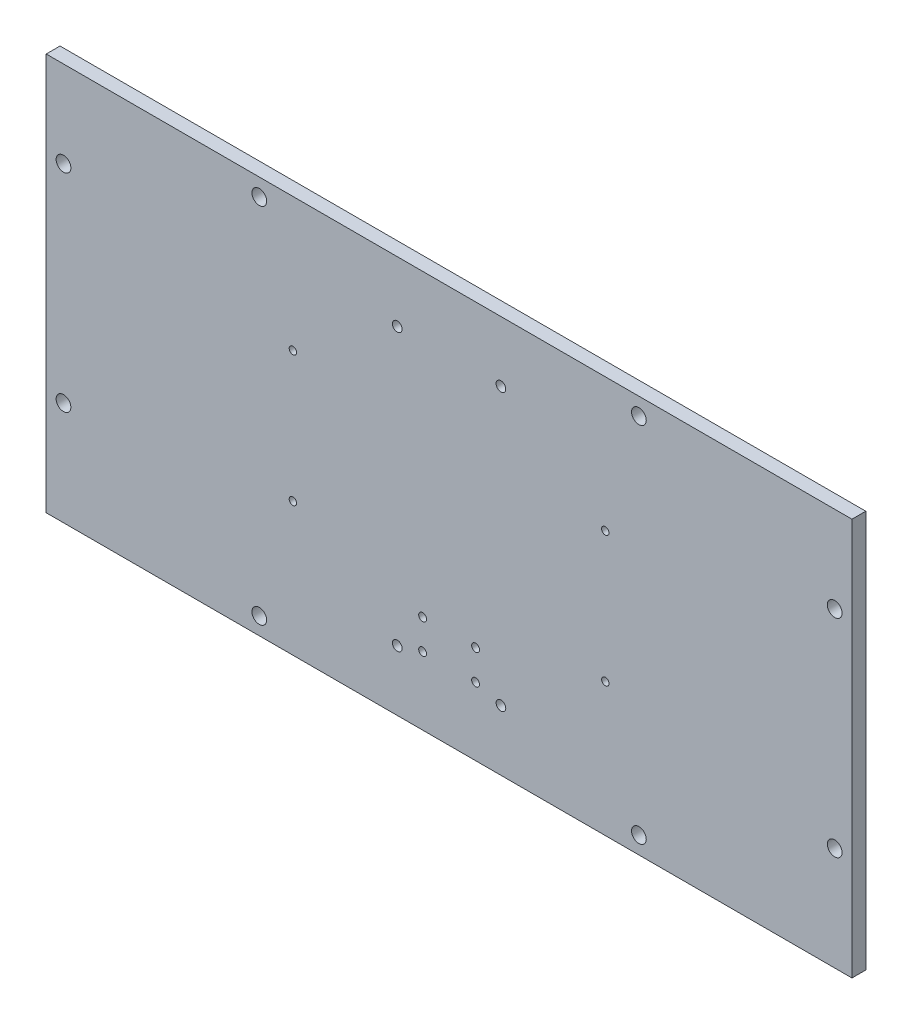
ISO-10303-21;
HEADER;
FILE_DESCRIPTION(('STEP AP214'),'2;1');
FILE_NAME('part.step','',(''),(''),'','','');
FILE_SCHEMA(('AUTOMOTIVE_DESIGN { 1 0 10303 214 1 1 1 1 }'));
ENDSEC;
DATA;
#1=APPLICATION_CONTEXT('core data for automotive mechanical design processes');
#2=APPLICATION_PROTOCOL_DEFINITION('international standard','automotive_design',2000,#1);
#3=PRODUCT_CONTEXT('',#1,'mechanical');
#4=PRODUCT('Part','Part','',(#3));
#5=PRODUCT_RELATED_PRODUCT_CATEGORY('part','',(#4));
#6=PRODUCT_DEFINITION_FORMATION('','',#4);
#7=PRODUCT_DEFINITION_CONTEXT('part definition',#1,'design');
#8=PRODUCT_DEFINITION('design','',#6,#7);
#9=PRODUCT_DEFINITION_SHAPE('','',#8);
#10=(LENGTH_UNIT() NAMED_UNIT(*) SI_UNIT(.MILLI.,.METRE.));
#11=(NAMED_UNIT(*) PLANE_ANGLE_UNIT() SI_UNIT($,.RADIAN.));
#12=(NAMED_UNIT(*) SI_UNIT($,.STERADIAN.) SOLID_ANGLE_UNIT());
#13=UNCERTAINTY_MEASURE_WITH_UNIT(LENGTH_MEASURE(1.E-05),#10,'distance_accuracy_value','');
#14=(GEOMETRIC_REPRESENTATION_CONTEXT(3) GLOBAL_UNCERTAINTY_ASSIGNED_CONTEXT((#13)) GLOBAL_UNIT_ASSIGNED_CONTEXT((#10,
#11,#12)) REPRESENTATION_CONTEXT('',''));
#15=CARTESIAN_POINT('',(0.,0.,0.));
#16=DIRECTION('',(0.,0.,1.));
#17=DIRECTION('',(1.,0.,0.));
#18=AXIS2_PLACEMENT_3D('',#15,#16,#17);
#19=CARTESIAN_POINT('',(0.,0.,6.));
#20=DIRECTION('',(0.,0.,1.));
#21=DIRECTION('',(1.,0.,0.));
#22=AXIS2_PLACEMENT_3D('',#19,#20,#21);
#23=PLANE('',#22);
#24=CARTESIAN_POINT('',(-82.4,-82.5,6.));
#25=DIRECTION('',(0.,0.,1.));
#26=DIRECTION('',(1.,0.,0.));
#27=AXIS2_PLACEMENT_3D('',#24,#25,#26);
#28=CIRCLE('',#27,3.19999999999999);
#29=CARTESIAN_POINT('',(-79.2,-82.5,6.));
#30=VERTEX_POINT('',#29);
#31=EDGE_CURVE('E216',#30,#30,#28,.T.);
#32=ORIENTED_EDGE('',*,*,#31,.F.);
#33=EDGE_LOOP('',(#32));
#34=FACE_BOUND('',#33,.T.);
#35=CARTESIAN_POINT('',(-11.5,-60.5,6.));
#36=DIRECTION('',(0.,0.,1.));
#37=DIRECTION('',(1.,0.,0.));
#38=AXIS2_PLACEMENT_3D('',#35,#36,#37);
#39=CIRCLE('',#38,1.7);
#40=CARTESIAN_POINT('',(-9.79999999999999,-60.5,6.));
#41=VERTEX_POINT('',#40);
#42=EDGE_CURVE('E204',#41,#41,#39,.T.);
#43=ORIENTED_EDGE('',*,*,#42,.F.);
#44=EDGE_LOOP('',(#43));
#45=FACE_BOUND('',#44,.T.);
#46=CARTESIAN_POINT('',(-11.5,-47.5,6.));
#47=DIRECTION('',(0.,0.,1.));
#48=DIRECTION('',(1.,0.,0.));
#49=AXIS2_PLACEMENT_3D('',#46,#47,#48);
#50=CIRCLE('',#49,1.7);
#51=CARTESIAN_POINT('',(-9.79999999999999,-47.5,6.));
#52=VERTEX_POINT('',#51);
#53=EDGE_CURVE('E192',#52,#52,#50,.T.);
#54=ORIENTED_EDGE('',*,*,#53,.F.);
#55=EDGE_LOOP('',(#54));
#56=FACE_BOUND('',#55,.T.);
#57=CARTESIAN_POINT('',(67.818,-32.0709999999999,6.));
#58=DIRECTION('',(0.,0.,1.));
#59=DIRECTION('',(1.,0.,0.));
#60=AXIS2_PLACEMENT_3D('',#57,#58,#59);
#61=CIRCLE('',#60,1.60000000000001);
#62=CARTESIAN_POINT('',(69.418,-32.0709999999999,6.));
#63=VERTEX_POINT('',#62);
#64=EDGE_CURVE('E180',#63,#63,#61,.T.);
#65=ORIENTED_EDGE('',*,*,#64,.F.);
#66=EDGE_LOOP('',(#65));
#67=FACE_BOUND('',#66,.T.);
#68=CARTESIAN_POINT('',(-67.818,24.5710000000001,6.));
#69=DIRECTION('',(0.,0.,1.));
#70=DIRECTION('',(1.,0.,0.));
#71=AXIS2_PLACEMENT_3D('',#68,#69,#70);
#72=CIRCLE('',#71,1.6);
#73=CARTESIAN_POINT('',(-66.218,24.5710000000001,6.));
#74=VERTEX_POINT('',#73);
#75=EDGE_CURVE('E168',#74,#74,#72,.T.);
#76=ORIENTED_EDGE('',*,*,#75,.F.);
#77=EDGE_LOOP('',(#76));
#78=FACE_BOUND('',#77,.T.);
#79=CARTESIAN_POINT('',(-167.4,45.,6.));
#80=DIRECTION('',(0.,0.,1.));
#81=DIRECTION('',(1.,0.,0.));
#82=AXIS2_PLACEMENT_3D('',#79,#80,#81);
#83=CIRCLE('',#82,3.19999999999998);
#84=CARTESIAN_POINT('',(-164.2,45.,6.));
#85=VERTEX_POINT('',#84);
#86=EDGE_CURVE('E156',#85,#85,#83,.T.);
#87=ORIENTED_EDGE('',*,*,#86,.F.);
#88=EDGE_LOOP('',(#87));
#89=FACE_BOUND('',#88,.T.);
#90=CARTESIAN_POINT('',(-22.5,56.25,6.));
#91=DIRECTION('',(0.,0.,1.));
#92=DIRECTION('',(1.,0.,0.));
#93=AXIS2_PLACEMENT_3D('',#90,#91,#92);
#94=CIRCLE('',#93,2.09999999999998);
#95=CARTESIAN_POINT('',(-20.4,56.25,6.));
#96=VERTEX_POINT('',#95);
#97=EDGE_CURVE('E144',#96,#96,#94,.T.);
#98=ORIENTED_EDGE('',*,*,#97,.F.);
#99=EDGE_LOOP('',(#98));
#100=FACE_BOUND('',#99,.T.);
#101=CARTESIAN_POINT('',(22.5,56.2500000000001,6.));
#102=DIRECTION('',(0.,0.,1.));
#103=DIRECTION('',(1.,0.,0.));
#104=AXIS2_PLACEMENT_3D('',#101,#102,#103);
#105=CIRCLE('',#104,2.09999999999998);
#106=CARTESIAN_POINT('',(24.6,56.2500000000001,6.));
#107=VERTEX_POINT('',#106);
#108=EDGE_CURVE('E132',#107,#107,#105,.T.);
#109=ORIENTED_EDGE('',*,*,#108,.F.);
#110=EDGE_LOOP('',(#109));
#111=FACE_BOUND('',#110,.T.);
#112=CARTESIAN_POINT('',(167.4,-45.,6.));
#113=DIRECTION('',(0.,0.,1.));
#114=DIRECTION('',(1.,0.,0.));
#115=AXIS2_PLACEMENT_3D('',#112,#113,#114);
#116=CIRCLE('',#115,3.19999999999998);
#117=CARTESIAN_POINT('',(170.6,-45.,6.));
#118=VERTEX_POINT('',#117);
#119=EDGE_CURVE('E120',#118,#118,#116,.T.);
#120=ORIENTED_EDGE('',*,*,#119,.F.);
#121=EDGE_LOOP('',(#120));
#122=FACE_BOUND('',#121,.T.);
#123=CARTESIAN_POINT('',(-82.4,75.,6.));
#124=DIRECTION('',(0.,0.,1.));
#125=DIRECTION('',(1.,0.,0.));
#126=AXIS2_PLACEMENT_3D('',#123,#124,#125);
#127=CIRCLE('',#126,3.19999999999998);
#128=CARTESIAN_POINT('',(-79.2,75.,6.));
#129=VERTEX_POINT('',#128);
#130=EDGE_CURVE('E99',#129,#129,#127,.T.);
#131=ORIENTED_EDGE('',*,*,#130,.F.);
#132=EDGE_LOOP('',(#131));
#133=FACE_BOUND('',#132,.T.);
#134=DIRECTION('',(0.,-1.,0.));
#135=VECTOR('',#134,1.);
#136=CARTESIAN_POINT('',(-174.9,82.5,6.));
#137=LINE('',#136,#135);
#138=CARTESIAN_POINT('',(-174.9,82.5,6.));
#139=VERTEX_POINT('',#138);
#140=CARTESIAN_POINT('',(-174.9,-90.,6.));
#141=VERTEX_POINT('',#140);
#142=EDGE_CURVE('E84',#139,#141,#137,.T.);
#143=ORIENTED_EDGE('',*,*,#142,.T.);
#144=DIRECTION('',(1.,0.,0.));
#145=VECTOR('',#144,1.);
#146=CARTESIAN_POINT('',(-174.9,-90.,6.));
#147=LINE('',#146,#145);
#148=CARTESIAN_POINT('',(174.9,-90.,6.));
#149=VERTEX_POINT('',#148);
#150=EDGE_CURVE('E79',#141,#149,#147,.T.);
#151=ORIENTED_EDGE('',*,*,#150,.T.);
#152=DIRECTION('',(0.,1.,0.));
#153=VECTOR('',#152,1.);
#154=CARTESIAN_POINT('',(174.9,82.5,6.));
#155=LINE('',#154,#153);
#156=CARTESIAN_POINT('',(174.9,82.5,6.));
#157=VERTEX_POINT('',#156);
#158=EDGE_CURVE('E82',#149,#157,#155,.T.);
#159=ORIENTED_EDGE('',*,*,#158,.T.);
#160=DIRECTION('',(-1.,0.,0.));
#161=VECTOR('',#160,1.);
#162=CARTESIAN_POINT('',(-174.9,82.5,6.));
#163=LINE('',#162,#161);
#164=EDGE_CURVE('E49',#157,#139,#163,.T.);
#165=ORIENTED_EDGE('',*,*,#164,.T.);
#166=EDGE_LOOP('',(#143,#151,#159,#165));
#167=FACE_BOUND('',#166,.T.);
#168=CARTESIAN_POINT('',(-167.4,-45.,6.));
#169=DIRECTION('',(0.,0.,1.));
#170=DIRECTION('',(1.,0.,0.));
#171=AXIS2_PLACEMENT_3D('',#168,#169,#170);
#172=CIRCLE('',#171,3.19999999999998);
#173=CARTESIAN_POINT('',(-164.2,-45.,6.));
#174=VERTEX_POINT('',#173);
#175=EDGE_CURVE('E114',#174,#174,#172,.T.);
#176=ORIENTED_EDGE('',*,*,#175,.F.);
#177=EDGE_LOOP('',(#176));
#178=FACE_BOUND('',#177,.T.);
#179=CARTESIAN_POINT('',(22.5,-63.7499999999999,6.));
#180=DIRECTION('',(0.,0.,1.));
#181=DIRECTION('',(1.,0.,0.));
#182=AXIS2_PLACEMENT_3D('',#179,#180,#181);
#183=CIRCLE('',#182,2.1);
#184=CARTESIAN_POINT('',(24.6,-63.7499999999999,6.));
#185=VERTEX_POINT('',#184);
#186=EDGE_CURVE('E126',#185,#185,#183,.T.);
#187=ORIENTED_EDGE('',*,*,#186,.F.);
#188=EDGE_LOOP('',(#187));
#189=FACE_BOUND('',#188,.T.);
#190=CARTESIAN_POINT('',(82.4,75.,6.));
#191=DIRECTION('',(0.,0.,1.));
#192=DIRECTION('',(1.,0.,0.));
#193=AXIS2_PLACEMENT_3D('',#190,#191,#192);
#194=CIRCLE('',#193,3.19999999999998);
#195=CARTESIAN_POINT('',(85.6,75.,6.));
#196=VERTEX_POINT('',#195);
#197=EDGE_CURVE('E138',#196,#196,#194,.T.);
#198=ORIENTED_EDGE('',*,*,#197,.F.);
#199=EDGE_LOOP('',(#198));
#200=FACE_BOUND('',#199,.T.);
#201=CARTESIAN_POINT('',(-22.5,-63.7499999999999,6.));
#202=DIRECTION('',(0.,0.,1.));
#203=DIRECTION('',(1.,0.,0.));
#204=AXIS2_PLACEMENT_3D('',#201,#202,#203);
#205=CIRCLE('',#204,2.1);
#206=CARTESIAN_POINT('',(-20.4,-63.7499999999999,6.));
#207=VERTEX_POINT('',#206);
#208=EDGE_CURVE('E150',#207,#207,#205,.T.);
#209=ORIENTED_EDGE('',*,*,#208,.F.);
#210=EDGE_LOOP('',(#209));
#211=FACE_BOUND('',#210,.T.);
#212=CARTESIAN_POINT('',(167.4,45.,6.));
#213=DIRECTION('',(0.,0.,1.));
#214=DIRECTION('',(1.,0.,0.));
#215=AXIS2_PLACEMENT_3D('',#212,#213,#214);
#216=CIRCLE('',#215,3.19999999999998);
#217=CARTESIAN_POINT('',(170.6,45.,6.));
#218=VERTEX_POINT('',#217);
#219=EDGE_CURVE('E162',#218,#218,#216,.T.);
#220=ORIENTED_EDGE('',*,*,#219,.F.);
#221=EDGE_LOOP('',(#220));
#222=FACE_BOUND('',#221,.T.);
#223=CARTESIAN_POINT('',(-67.818,-32.0709999999999,6.));
#224=DIRECTION('',(0.,0.,1.));
#225=DIRECTION('',(1.,0.,0.));
#226=AXIS2_PLACEMENT_3D('',#223,#224,#225);
#227=CIRCLE('',#226,1.60000000000001);
#228=CARTESIAN_POINT('',(-66.218,-32.0709999999999,6.));
#229=VERTEX_POINT('',#228);
#230=EDGE_CURVE('E174',#229,#229,#227,.T.);
#231=ORIENTED_EDGE('',*,*,#230,.F.);
#232=EDGE_LOOP('',(#231));
#233=FACE_BOUND('',#232,.T.);
#234=CARTESIAN_POINT('',(67.818,24.5710000000001,6.));
#235=DIRECTION('',(0.,0.,1.));
#236=DIRECTION('',(1.,0.,0.));
#237=AXIS2_PLACEMENT_3D('',#234,#235,#236);
#238=CIRCLE('',#237,1.6);
#239=CARTESIAN_POINT('',(69.418,24.5710000000001,6.));
#240=VERTEX_POINT('',#239);
#241=EDGE_CURVE('E186',#240,#240,#238,.T.);
#242=ORIENTED_EDGE('',*,*,#241,.F.);
#243=EDGE_LOOP('',(#242));
#244=FACE_BOUND('',#243,.T.);
#245=CARTESIAN_POINT('',(11.4999999999999,-47.5,6.));
#246=DIRECTION('',(0.,0.,1.));
#247=DIRECTION('',(1.,0.,0.));
#248=AXIS2_PLACEMENT_3D('',#245,#246,#247);
#249=CIRCLE('',#248,1.7);
#250=CARTESIAN_POINT('',(13.1999999999999,-47.5,6.));
#251=VERTEX_POINT('',#250);
#252=EDGE_CURVE('E198',#251,#251,#249,.T.);
#253=ORIENTED_EDGE('',*,*,#252,.F.);
#254=EDGE_LOOP('',(#253));
#255=FACE_BOUND('',#254,.T.);
#256=CARTESIAN_POINT('',(11.4999999999999,-60.5,6.));
#257=DIRECTION('',(0.,0.,1.));
#258=DIRECTION('',(1.,0.,0.));
#259=AXIS2_PLACEMENT_3D('',#256,#257,#258);
#260=CIRCLE('',#259,1.7);
#261=CARTESIAN_POINT('',(13.1999999999999,-60.5,6.));
#262=VERTEX_POINT('',#261);
#263=EDGE_CURVE('E210',#262,#262,#260,.T.);
#264=ORIENTED_EDGE('',*,*,#263,.F.);
#265=EDGE_LOOP('',(#264));
#266=FACE_BOUND('',#265,.T.);
#267=CARTESIAN_POINT('',(82.4,-82.5,6.));
#268=DIRECTION('',(0.,0.,1.));
#269=DIRECTION('',(1.,0.,0.));
#270=AXIS2_PLACEMENT_3D('',#267,#268,#269);
#271=CIRCLE('',#270,3.19999999999999);
#272=CARTESIAN_POINT('',(85.6,-82.5,6.));
#273=VERTEX_POINT('',#272);
#274=EDGE_CURVE('E222',#273,#273,#271,.T.);
#275=ORIENTED_EDGE('',*,*,#274,.F.);
#276=EDGE_LOOP('',(#275));
#277=FACE_BOUND('',#276,.T.);
#278=ADVANCED_FACE('F32',(#34,#45,#56,#67,#78,#89,#100,#111,#122,#133,#167,#178,#189,#200,#211,
#222,#233,#244,#255,#266,#277),#23,.T.);
#279=CARTESIAN_POINT('',(0.,0.,0.));
#280=DIRECTION('',(0.,0.,1.));
#281=DIRECTION('',(1.,0.,0.));
#282=AXIS2_PLACEMENT_3D('',#279,#280,#281);
#283=PLANE('',#282);
#284=CARTESIAN_POINT('',(-82.4,-82.5,0.));
#285=DIRECTION('',(0.,0.,1.));
#286=DIRECTION('',(1.,0.,0.));
#287=AXIS2_PLACEMENT_3D('',#284,#285,#286);
#288=CIRCLE('',#287,3.19999999999999);
#289=CARTESIAN_POINT('',(-79.2,-82.5,0.));
#290=VERTEX_POINT('',#289);
#291=EDGE_CURVE('E219',#290,#290,#288,.T.);
#292=ORIENTED_EDGE('',*,*,#291,.T.);
#293=EDGE_LOOP('',(#292));
#294=FACE_BOUND('',#293,.T.);
#295=CARTESIAN_POINT('',(-11.5,-60.5,0.));
#296=DIRECTION('',(0.,0.,1.));
#297=DIRECTION('',(1.,0.,0.));
#298=AXIS2_PLACEMENT_3D('',#295,#296,#297);
#299=CIRCLE('',#298,1.7);
#300=CARTESIAN_POINT('',(-9.79999999999999,-60.5,0.));
#301=VERTEX_POINT('',#300);
#302=EDGE_CURVE('E207',#301,#301,#299,.T.);
#303=ORIENTED_EDGE('',*,*,#302,.T.);
#304=EDGE_LOOP('',(#303));
#305=FACE_BOUND('',#304,.T.);
#306=CARTESIAN_POINT('',(-11.5,-47.5,0.));
#307=DIRECTION('',(0.,0.,1.));
#308=DIRECTION('',(1.,0.,0.));
#309=AXIS2_PLACEMENT_3D('',#306,#307,#308);
#310=CIRCLE('',#309,1.7);
#311=CARTESIAN_POINT('',(-9.79999999999999,-47.5,0.));
#312=VERTEX_POINT('',#311);
#313=EDGE_CURVE('E195',#312,#312,#310,.T.);
#314=ORIENTED_EDGE('',*,*,#313,.T.);
#315=EDGE_LOOP('',(#314));
#316=FACE_BOUND('',#315,.T.);
#317=CARTESIAN_POINT('',(67.818,-32.0709999999999,0.));
#318=DIRECTION('',(0.,0.,1.));
#319=DIRECTION('',(1.,0.,0.));
#320=AXIS2_PLACEMENT_3D('',#317,#318,#319);
#321=CIRCLE('',#320,1.60000000000001);
#322=CARTESIAN_POINT('',(69.418,-32.0709999999999,0.));
#323=VERTEX_POINT('',#322);
#324=EDGE_CURVE('E183',#323,#323,#321,.T.);
#325=ORIENTED_EDGE('',*,*,#324,.T.);
#326=EDGE_LOOP('',(#325));
#327=FACE_BOUND('',#326,.T.);
#328=CARTESIAN_POINT('',(-67.818,24.5710000000001,0.));
#329=DIRECTION('',(0.,0.,1.));
#330=DIRECTION('',(1.,0.,0.));
#331=AXIS2_PLACEMENT_3D('',#328,#329,#330);
#332=CIRCLE('',#331,1.6);
#333=CARTESIAN_POINT('',(-66.218,24.5710000000001,0.));
#334=VERTEX_POINT('',#333);
#335=EDGE_CURVE('E171',#334,#334,#332,.T.);
#336=ORIENTED_EDGE('',*,*,#335,.T.);
#337=EDGE_LOOP('',(#336));
#338=FACE_BOUND('',#337,.T.);
#339=CARTESIAN_POINT('',(-167.4,45.,0.));
#340=DIRECTION('',(0.,0.,1.));
#341=DIRECTION('',(1.,0.,0.));
#342=AXIS2_PLACEMENT_3D('',#339,#340,#341);
#343=CIRCLE('',#342,3.19999999999998);
#344=CARTESIAN_POINT('',(-164.2,45.,0.));
#345=VERTEX_POINT('',#344);
#346=EDGE_CURVE('E159',#345,#345,#343,.T.);
#347=ORIENTED_EDGE('',*,*,#346,.T.);
#348=EDGE_LOOP('',(#347));
#349=FACE_BOUND('',#348,.T.);
#350=CARTESIAN_POINT('',(-22.5,56.25,0.));
#351=DIRECTION('',(0.,0.,1.));
#352=DIRECTION('',(1.,0.,0.));
#353=AXIS2_PLACEMENT_3D('',#350,#351,#352);
#354=CIRCLE('',#353,2.09999999999998);
#355=CARTESIAN_POINT('',(-20.4,56.25,0.));
#356=VERTEX_POINT('',#355);
#357=EDGE_CURVE('E147',#356,#356,#354,.T.);
#358=ORIENTED_EDGE('',*,*,#357,.T.);
#359=EDGE_LOOP('',(#358));
#360=FACE_BOUND('',#359,.T.);
#361=CARTESIAN_POINT('',(22.5,56.2500000000001,0.));
#362=DIRECTION('',(0.,0.,1.));
#363=DIRECTION('',(1.,0.,0.));
#364=AXIS2_PLACEMENT_3D('',#361,#362,#363);
#365=CIRCLE('',#364,2.09999999999998);
#366=CARTESIAN_POINT('',(24.6,56.2500000000001,0.));
#367=VERTEX_POINT('',#366);
#368=EDGE_CURVE('E135',#367,#367,#365,.T.);
#369=ORIENTED_EDGE('',*,*,#368,.T.);
#370=EDGE_LOOP('',(#369));
#371=FACE_BOUND('',#370,.T.);
#372=CARTESIAN_POINT('',(167.4,-45.,0.));
#373=DIRECTION('',(0.,0.,1.));
#374=DIRECTION('',(1.,0.,0.));
#375=AXIS2_PLACEMENT_3D('',#372,#373,#374);
#376=CIRCLE('',#375,3.19999999999998);
#377=CARTESIAN_POINT('',(170.6,-45.,0.));
#378=VERTEX_POINT('',#377);
#379=EDGE_CURVE('E123',#378,#378,#376,.T.);
#380=ORIENTED_EDGE('',*,*,#379,.T.);
#381=EDGE_LOOP('',(#380));
#382=FACE_BOUND('',#381,.T.);
#383=CARTESIAN_POINT('',(-82.4,75.,0.));
#384=DIRECTION('',(0.,0.,1.));
#385=DIRECTION('',(1.,0.,0.));
#386=AXIS2_PLACEMENT_3D('',#383,#384,#385);
#387=CIRCLE('',#386,3.19999999999998);
#388=CARTESIAN_POINT('',(-79.2,75.,0.));
#389=VERTEX_POINT('',#388);
#390=EDGE_CURVE('E111',#389,#389,#387,.T.);
#391=ORIENTED_EDGE('',*,*,#390,.T.);
#392=EDGE_LOOP('',(#391));
#393=FACE_BOUND('',#392,.T.);
#394=DIRECTION('',(0.,-1.,0.));
#395=VECTOR('',#394,1.);
#396=CARTESIAN_POINT('',(-174.9,82.5,0.));
#397=LINE('',#396,#395);
#398=CARTESIAN_POINT('',(-174.9,82.5,0.));
#399=VERTEX_POINT('',#398);
#400=CARTESIAN_POINT('',(-174.9,-90.,0.));
#401=VERTEX_POINT('',#400);
#402=EDGE_CURVE('E96',#399,#401,#397,.T.);
#403=ORIENTED_EDGE('',*,*,#402,.F.);
#404=DIRECTION('',(-1.,0.,0.));
#405=VECTOR('',#404,1.);
#406=CARTESIAN_POINT('',(-174.9,82.5,0.));
#407=LINE('',#406,#405);
#408=CARTESIAN_POINT('',(174.9,82.5,0.));
#409=VERTEX_POINT('',#408);
#410=EDGE_CURVE('E72',#409,#399,#407,.T.);
#411=ORIENTED_EDGE('',*,*,#410,.F.);
#412=DIRECTION('',(0.,1.,0.));
#413=VECTOR('',#412,1.);
#414=CARTESIAN_POINT('',(174.9,82.5,0.));
#415=LINE('',#414,#413);
#416=CARTESIAN_POINT('',(174.9,-90.,0.));
#417=VERTEX_POINT('',#416);
#418=EDGE_CURVE('E66',#417,#409,#415,.T.);
#419=ORIENTED_EDGE('',*,*,#418,.F.);
#420=DIRECTION('',(1.,0.,0.));
#421=VECTOR('',#420,1.);
#422=CARTESIAN_POINT('',(-174.9,-90.,0.));
#423=LINE('',#422,#421);
#424=EDGE_CURVE('E88',#401,#417,#423,.T.);
#425=ORIENTED_EDGE('',*,*,#424,.F.);
#426=EDGE_LOOP('',(#403,#411,#419,#425));
#427=FACE_BOUND('',#426,.T.);
#428=CARTESIAN_POINT('',(-167.4,-45.,0.));
#429=DIRECTION('',(0.,0.,1.));
#430=DIRECTION('',(1.,0.,0.));
#431=AXIS2_PLACEMENT_3D('',#428,#429,#430);
#432=CIRCLE('',#431,3.19999999999998);
#433=CARTESIAN_POINT('',(-164.2,-45.,0.));
#434=VERTEX_POINT('',#433);
#435=EDGE_CURVE('E117',#434,#434,#432,.T.);
#436=ORIENTED_EDGE('',*,*,#435,.T.);
#437=EDGE_LOOP('',(#436));
#438=FACE_BOUND('',#437,.T.);
#439=CARTESIAN_POINT('',(22.5,-63.7499999999999,0.));
#440=DIRECTION('',(0.,0.,1.));
#441=DIRECTION('',(1.,0.,0.));
#442=AXIS2_PLACEMENT_3D('',#439,#440,#441);
#443=CIRCLE('',#442,2.1);
#444=CARTESIAN_POINT('',(24.6,-63.7499999999999,0.));
#445=VERTEX_POINT('',#444);
#446=EDGE_CURVE('E129',#445,#445,#443,.T.);
#447=ORIENTED_EDGE('',*,*,#446,.T.);
#448=EDGE_LOOP('',(#447));
#449=FACE_BOUND('',#448,.T.);
#450=CARTESIAN_POINT('',(82.4,75.,0.));
#451=DIRECTION('',(0.,0.,1.));
#452=DIRECTION('',(1.,0.,0.));
#453=AXIS2_PLACEMENT_3D('',#450,#451,#452);
#454=CIRCLE('',#453,3.19999999999998);
#455=CARTESIAN_POINT('',(85.6,75.,0.));
#456=VERTEX_POINT('',#455);
#457=EDGE_CURVE('E141',#456,#456,#454,.T.);
#458=ORIENTED_EDGE('',*,*,#457,.T.);
#459=EDGE_LOOP('',(#458));
#460=FACE_BOUND('',#459,.T.);
#461=CARTESIAN_POINT('',(-22.5,-63.7499999999999,0.));
#462=DIRECTION('',(0.,0.,1.));
#463=DIRECTION('',(1.,0.,0.));
#464=AXIS2_PLACEMENT_3D('',#461,#462,#463);
#465=CIRCLE('',#464,2.1);
#466=CARTESIAN_POINT('',(-20.4,-63.7499999999999,0.));
#467=VERTEX_POINT('',#466);
#468=EDGE_CURVE('E153',#467,#467,#465,.T.);
#469=ORIENTED_EDGE('',*,*,#468,.T.);
#470=EDGE_LOOP('',(#469));
#471=FACE_BOUND('',#470,.T.);
#472=CARTESIAN_POINT('',(167.4,45.,0.));
#473=DIRECTION('',(0.,0.,1.));
#474=DIRECTION('',(1.,0.,0.));
#475=AXIS2_PLACEMENT_3D('',#472,#473,#474);
#476=CIRCLE('',#475,3.19999999999998);
#477=CARTESIAN_POINT('',(170.6,45.,0.));
#478=VERTEX_POINT('',#477);
#479=EDGE_CURVE('E165',#478,#478,#476,.T.);
#480=ORIENTED_EDGE('',*,*,#479,.T.);
#481=EDGE_LOOP('',(#480));
#482=FACE_BOUND('',#481,.T.);
#483=CARTESIAN_POINT('',(-67.818,-32.0709999999999,0.));
#484=DIRECTION('',(0.,0.,1.));
#485=DIRECTION('',(1.,0.,0.));
#486=AXIS2_PLACEMENT_3D('',#483,#484,#485);
#487=CIRCLE('',#486,1.60000000000001);
#488=CARTESIAN_POINT('',(-66.218,-32.0709999999999,0.));
#489=VERTEX_POINT('',#488);
#490=EDGE_CURVE('E177',#489,#489,#487,.T.);
#491=ORIENTED_EDGE('',*,*,#490,.T.);
#492=EDGE_LOOP('',(#491));
#493=FACE_BOUND('',#492,.T.);
#494=CARTESIAN_POINT('',(67.818,24.5710000000001,0.));
#495=DIRECTION('',(0.,0.,1.));
#496=DIRECTION('',(1.,0.,0.));
#497=AXIS2_PLACEMENT_3D('',#494,#495,#496);
#498=CIRCLE('',#497,1.6);
#499=CARTESIAN_POINT('',(69.418,24.5710000000001,0.));
#500=VERTEX_POINT('',#499);
#501=EDGE_CURVE('E189',#500,#500,#498,.T.);
#502=ORIENTED_EDGE('',*,*,#501,.T.);
#503=EDGE_LOOP('',(#502));
#504=FACE_BOUND('',#503,.T.);
#505=CARTESIAN_POINT('',(11.4999999999999,-47.5,0.));
#506=DIRECTION('',(0.,0.,1.));
#507=DIRECTION('',(1.,0.,0.));
#508=AXIS2_PLACEMENT_3D('',#505,#506,#507);
#509=CIRCLE('',#508,1.7);
#510=CARTESIAN_POINT('',(13.1999999999999,-47.5,0.));
#511=VERTEX_POINT('',#510);
#512=EDGE_CURVE('E201',#511,#511,#509,.T.);
#513=ORIENTED_EDGE('',*,*,#512,.T.);
#514=EDGE_LOOP('',(#513));
#515=FACE_BOUND('',#514,.T.);
#516=CARTESIAN_POINT('',(11.4999999999999,-60.5,0.));
#517=DIRECTION('',(0.,0.,1.));
#518=DIRECTION('',(1.,0.,0.));
#519=AXIS2_PLACEMENT_3D('',#516,#517,#518);
#520=CIRCLE('',#519,1.7);
#521=CARTESIAN_POINT('',(13.1999999999999,-60.5,0.));
#522=VERTEX_POINT('',#521);
#523=EDGE_CURVE('E213',#522,#522,#520,.T.);
#524=ORIENTED_EDGE('',*,*,#523,.T.);
#525=EDGE_LOOP('',(#524));
#526=FACE_BOUND('',#525,.T.);
#527=CARTESIAN_POINT('',(82.4,-82.5,0.));
#528=DIRECTION('',(0.,0.,1.));
#529=DIRECTION('',(1.,0.,0.));
#530=AXIS2_PLACEMENT_3D('',#527,#528,#529);
#531=CIRCLE('',#530,3.19999999999999);
#532=CARTESIAN_POINT('',(85.6,-82.5,0.));
#533=VERTEX_POINT('',#532);
#534=EDGE_CURVE('E225',#533,#533,#531,.T.);
#535=ORIENTED_EDGE('',*,*,#534,.T.);
#536=EDGE_LOOP('',(#535));
#537=FACE_BOUND('',#536,.T.);
#538=ADVANCED_FACE('F107',(#294,#305,#316,#327,#338,#349,#360,#371,#382,#393,#427,#438,#449,
#460,#471,#482,#493,#504,#515,#526,#537),#283,.F.);
#539=CARTESIAN_POINT('',(-174.9,82.5,6.));
#540=DIRECTION('',(1.,0.,0.));
#541=DIRECTION('',(0.,1.,0.));
#542=AXIS2_PLACEMENT_3D('',#539,#540,#541);
#543=PLANE('',#542);
#544=ORIENTED_EDGE('',*,*,#402,.T.);
#545=DIRECTION('',(0.,0.,-1.));
#546=VECTOR('',#545,1.);
#547=CARTESIAN_POINT('',(-174.9,-90.,6.));
#548=LINE('',#547,#546);
#549=EDGE_CURVE('E11',#141,#401,#548,.T.);
#550=ORIENTED_EDGE('',*,*,#549,.F.);
#551=ORIENTED_EDGE('',*,*,#142,.F.);
#552=DIRECTION('',(0.,0.,-1.));
#553=VECTOR('',#552,1.);
#554=CARTESIAN_POINT('',(-174.9,82.5,6.));
#555=LINE('',#554,#553);
#556=EDGE_CURVE('E92',#139,#399,#555,.T.);
#557=ORIENTED_EDGE('',*,*,#556,.T.);
#558=EDGE_LOOP('',(#544,#550,#551,#557));
#559=FACE_BOUND('',#558,.T.);
#560=ADVANCED_FACE('F34',(#559),#543,.F.);
#561=CARTESIAN_POINT('',(-174.9,-90.,6.));
#562=DIRECTION('',(0.,1.,0.));
#563=DIRECTION('',(-1.,0.,0.));
#564=AXIS2_PLACEMENT_3D('',#561,#562,#563);
#565=PLANE('',#564);
#566=ORIENTED_EDGE('',*,*,#424,.T.);
#567=DIRECTION('',(0.,0.,-1.));
#568=VECTOR('',#567,1.);
#569=CARTESIAN_POINT('',(174.9,-90.,6.));
#570=LINE('',#569,#568);
#571=EDGE_CURVE('E41',#149,#417,#570,.T.);
#572=ORIENTED_EDGE('',*,*,#571,.F.);
#573=ORIENTED_EDGE('',*,*,#150,.F.);
#574=ORIENTED_EDGE('',*,*,#549,.T.);
#575=EDGE_LOOP('',(#566,#572,#573,#574));
#576=FACE_BOUND('',#575,.T.);
#577=ADVANCED_FACE('F87',(#576),#565,.F.);
#578=CARTESIAN_POINT('',(174.9,82.5,6.));
#579=DIRECTION('',(-1.,0.,0.));
#580=DIRECTION('',(0.,-1.,0.));
#581=AXIS2_PLACEMENT_3D('',#578,#579,#580);
#582=PLANE('',#581);
#583=ORIENTED_EDGE('',*,*,#418,.T.);
#584=DIRECTION('',(0.,0.,-1.));
#585=VECTOR('',#584,1.);
#586=CARTESIAN_POINT('',(174.9,82.5,6.));
#587=LINE('',#586,#585);
#588=EDGE_CURVE('E89',#157,#409,#587,.T.);
#589=ORIENTED_EDGE('',*,*,#588,.F.);
#590=ORIENTED_EDGE('',*,*,#158,.F.);
#591=ORIENTED_EDGE('',*,*,#571,.T.);
#592=EDGE_LOOP('',(#583,#589,#590,#591));
#593=FACE_BOUND('',#592,.T.);
#594=ADVANCED_FACE('F90',(#593),#582,.F.);
#595=CARTESIAN_POINT('',(-174.9,82.5,6.));
#596=DIRECTION('',(0.,-1.,0.));
#597=DIRECTION('',(0.,0.,-1.));
#598=AXIS2_PLACEMENT_3D('',#595,#596,#597);
#599=PLANE('',#598);
#600=ORIENTED_EDGE('',*,*,#410,.T.);
#601=ORIENTED_EDGE('',*,*,#556,.F.);
#602=ORIENTED_EDGE('',*,*,#164,.F.);
#603=ORIENTED_EDGE('',*,*,#588,.T.);
#604=EDGE_LOOP('',(#600,#601,#602,#603));
#605=FACE_BOUND('',#604,.T.);
#606=ADVANCED_FACE('F104',(#605),#599,.F.);
#607=CARTESIAN_POINT('',(-82.4,75.,6.));
#608=DIRECTION('',(0.,0.,-1.));
#609=DIRECTION('',(-1.,0.,0.));
#610=AXIS2_PLACEMENT_3D('',#607,#608,#609);
#611=CYLINDRICAL_SURFACE('',#610,3.19999999999998);
#612=ORIENTED_EDGE('',*,*,#130,.T.);
#613=EDGE_LOOP('',(#612));
#614=FACE_BOUND('',#613,.T.);
#615=ORIENTED_EDGE('',*,*,#390,.F.);
#616=EDGE_LOOP('',(#615));
#617=FACE_BOUND('',#616,.T.);
#618=ADVANCED_FACE('F245',(#614,#617),#611,.F.);
#619=CARTESIAN_POINT('',(-167.4,-45.,6.));
#620=DIRECTION('',(0.,0.,-1.));
#621=DIRECTION('',(-1.,0.,0.));
#622=AXIS2_PLACEMENT_3D('',#619,#620,#621);
#623=CYLINDRICAL_SURFACE('',#622,3.19999999999998);
#624=ORIENTED_EDGE('',*,*,#175,.T.);
#625=EDGE_LOOP('',(#624));
#626=FACE_BOUND('',#625,.T.);
#627=ORIENTED_EDGE('',*,*,#435,.F.);
#628=EDGE_LOOP('',(#627));
#629=FACE_BOUND('',#628,.T.);
#630=ADVANCED_FACE('F291',(#626,#629),#623,.F.);
#631=CARTESIAN_POINT('',(167.4,-45.,6.));
#632=DIRECTION('',(0.,0.,-1.));
#633=DIRECTION('',(-1.,0.,0.));
#634=AXIS2_PLACEMENT_3D('',#631,#632,#633);
#635=CYLINDRICAL_SURFACE('',#634,3.19999999999998);
#636=ORIENTED_EDGE('',*,*,#119,.T.);
#637=EDGE_LOOP('',(#636));
#638=FACE_BOUND('',#637,.T.);
#639=ORIENTED_EDGE('',*,*,#379,.F.);
#640=EDGE_LOOP('',(#639));
#641=FACE_BOUND('',#640,.T.);
#642=ADVANCED_FACE('F299',(#638,#641),#635,.F.);
#643=CARTESIAN_POINT('',(22.5,-63.7499999999999,6.));
#644=DIRECTION('',(0.,0.,-1.));
#645=DIRECTION('',(-1.,0.,0.));
#646=AXIS2_PLACEMENT_3D('',#643,#644,#645);
#647=CYLINDRICAL_SURFACE('',#646,2.1);
#648=ORIENTED_EDGE('',*,*,#186,.T.);
#649=EDGE_LOOP('',(#648));
#650=FACE_BOUND('',#649,.T.);
#651=ORIENTED_EDGE('',*,*,#446,.F.);
#652=EDGE_LOOP('',(#651));
#653=FACE_BOUND('',#652,.T.);
#654=ADVANCED_FACE('F307',(#650,#653),#647,.F.);
#655=CARTESIAN_POINT('',(22.5,56.2500000000001,6.));
#656=DIRECTION('',(0.,0.,-1.));
#657=DIRECTION('',(-1.,0.,0.));
#658=AXIS2_PLACEMENT_3D('',#655,#656,#657);
#659=CYLINDRICAL_SURFACE('',#658,2.09999999999998);
#660=ORIENTED_EDGE('',*,*,#108,.T.);
#661=EDGE_LOOP('',(#660));
#662=FACE_BOUND('',#661,.T.);
#663=ORIENTED_EDGE('',*,*,#368,.F.);
#664=EDGE_LOOP('',(#663));
#665=FACE_BOUND('',#664,.T.);
#666=ADVANCED_FACE('F316',(#662,#665),#659,.F.);
#667=CARTESIAN_POINT('',(82.4,75.,6.));
#668=DIRECTION('',(0.,0.,-1.));
#669=DIRECTION('',(-1.,0.,0.));
#670=AXIS2_PLACEMENT_3D('',#667,#668,#669);
#671=CYLINDRICAL_SURFACE('',#670,3.19999999999998);
#672=ORIENTED_EDGE('',*,*,#197,.T.);
#673=EDGE_LOOP('',(#672));
#674=FACE_BOUND('',#673,.T.);
#675=ORIENTED_EDGE('',*,*,#457,.F.);
#676=EDGE_LOOP('',(#675));
#677=FACE_BOUND('',#676,.T.);
#678=ADVANCED_FACE('F325',(#674,#677),#671,.F.);
#679=CARTESIAN_POINT('',(-22.5,56.25,6.));
#680=DIRECTION('',(0.,0.,-1.));
#681=DIRECTION('',(-1.,0.,0.));
#682=AXIS2_PLACEMENT_3D('',#679,#680,#681);
#683=CYLINDRICAL_SURFACE('',#682,2.09999999999998);
#684=ORIENTED_EDGE('',*,*,#97,.T.);
#685=EDGE_LOOP('',(#684));
#686=FACE_BOUND('',#685,.T.);
#687=ORIENTED_EDGE('',*,*,#357,.F.);
#688=EDGE_LOOP('',(#687));
#689=FACE_BOUND('',#688,.T.);
#690=ADVANCED_FACE('F334',(#686,#689),#683,.F.);
#691=CARTESIAN_POINT('',(-22.5,-63.7499999999999,6.));
#692=DIRECTION('',(0.,0.,-1.));
#693=DIRECTION('',(-1.,0.,0.));
#694=AXIS2_PLACEMENT_3D('',#691,#692,#693);
#695=CYLINDRICAL_SURFACE('',#694,2.1);
#696=ORIENTED_EDGE('',*,*,#208,.T.);
#697=EDGE_LOOP('',(#696));
#698=FACE_BOUND('',#697,.T.);
#699=ORIENTED_EDGE('',*,*,#468,.F.);
#700=EDGE_LOOP('',(#699));
#701=FACE_BOUND('',#700,.T.);
#702=ADVANCED_FACE('F343',(#698,#701),#695,.F.);
#703=CARTESIAN_POINT('',(-167.4,45.,6.));
#704=DIRECTION('',(0.,0.,-1.));
#705=DIRECTION('',(-1.,0.,0.));
#706=AXIS2_PLACEMENT_3D('',#703,#704,#705);
#707=CYLINDRICAL_SURFACE('',#706,3.19999999999998);
#708=ORIENTED_EDGE('',*,*,#86,.T.);
#709=EDGE_LOOP('',(#708));
#710=FACE_BOUND('',#709,.T.);
#711=ORIENTED_EDGE('',*,*,#346,.F.);
#712=EDGE_LOOP('',(#711));
#713=FACE_BOUND('',#712,.T.);
#714=ADVANCED_FACE('F352',(#710,#713),#707,.F.);
#715=CARTESIAN_POINT('',(167.4,45.,6.));
#716=DIRECTION('',(0.,0.,-1.));
#717=DIRECTION('',(-1.,0.,0.));
#718=AXIS2_PLACEMENT_3D('',#715,#716,#717);
#719=CYLINDRICAL_SURFACE('',#718,3.19999999999998);
#720=ORIENTED_EDGE('',*,*,#219,.T.);
#721=EDGE_LOOP('',(#720));
#722=FACE_BOUND('',#721,.T.);
#723=ORIENTED_EDGE('',*,*,#479,.F.);
#724=EDGE_LOOP('',(#723));
#725=FACE_BOUND('',#724,.T.);
#726=ADVANCED_FACE('F361',(#722,#725),#719,.F.);
#727=CARTESIAN_POINT('',(-67.818,24.5710000000001,6.));
#728=DIRECTION('',(0.,0.,-1.));
#729=DIRECTION('',(-1.,0.,0.));
#730=AXIS2_PLACEMENT_3D('',#727,#728,#729);
#731=CYLINDRICAL_SURFACE('',#730,1.6);
#732=ORIENTED_EDGE('',*,*,#75,.T.);
#733=EDGE_LOOP('',(#732));
#734=FACE_BOUND('',#733,.T.);
#735=ORIENTED_EDGE('',*,*,#335,.F.);
#736=EDGE_LOOP('',(#735));
#737=FACE_BOUND('',#736,.T.);
#738=ADVANCED_FACE('F370',(#734,#737),#731,.F.);
#739=CARTESIAN_POINT('',(-67.818,-32.0709999999999,6.));
#740=DIRECTION('',(0.,0.,-1.));
#741=DIRECTION('',(-1.,0.,0.));
#742=AXIS2_PLACEMENT_3D('',#739,#740,#741);
#743=CYLINDRICAL_SURFACE('',#742,1.60000000000001);
#744=ORIENTED_EDGE('',*,*,#230,.T.);
#745=EDGE_LOOP('',(#744));
#746=FACE_BOUND('',#745,.T.);
#747=ORIENTED_EDGE('',*,*,#490,.F.);
#748=EDGE_LOOP('',(#747));
#749=FACE_BOUND('',#748,.T.);
#750=ADVANCED_FACE('F379',(#746,#749),#743,.F.);
#751=CARTESIAN_POINT('',(67.818,-32.0709999999999,6.));
#752=DIRECTION('',(0.,0.,-1.));
#753=DIRECTION('',(-1.,0.,0.));
#754=AXIS2_PLACEMENT_3D('',#751,#752,#753);
#755=CYLINDRICAL_SURFACE('',#754,1.60000000000001);
#756=ORIENTED_EDGE('',*,*,#64,.T.);
#757=EDGE_LOOP('',(#756));
#758=FACE_BOUND('',#757,.T.);
#759=ORIENTED_EDGE('',*,*,#324,.F.);
#760=EDGE_LOOP('',(#759));
#761=FACE_BOUND('',#760,.T.);
#762=ADVANCED_FACE('F388',(#758,#761),#755,.F.);
#763=CARTESIAN_POINT('',(67.818,24.5710000000001,6.));
#764=DIRECTION('',(0.,0.,-1.));
#765=DIRECTION('',(-1.,0.,0.));
#766=AXIS2_PLACEMENT_3D('',#763,#764,#765);
#767=CYLINDRICAL_SURFACE('',#766,1.6);
#768=ORIENTED_EDGE('',*,*,#241,.T.);
#769=EDGE_LOOP('',(#768));
#770=FACE_BOUND('',#769,.T.);
#771=ORIENTED_EDGE('',*,*,#501,.F.);
#772=EDGE_LOOP('',(#771));
#773=FACE_BOUND('',#772,.T.);
#774=ADVANCED_FACE('F397',(#770,#773),#767,.F.);
#775=CARTESIAN_POINT('',(-11.5,-47.5,6.));
#776=DIRECTION('',(0.,0.,-1.));
#777=DIRECTION('',(-1.,0.,0.));
#778=AXIS2_PLACEMENT_3D('',#775,#776,#777);
#779=CYLINDRICAL_SURFACE('',#778,1.7);
#780=ORIENTED_EDGE('',*,*,#53,.T.);
#781=EDGE_LOOP('',(#780));
#782=FACE_BOUND('',#781,.T.);
#783=ORIENTED_EDGE('',*,*,#313,.F.);
#784=EDGE_LOOP('',(#783));
#785=FACE_BOUND('',#784,.T.);
#786=ADVANCED_FACE('F406',(#782,#785),#779,.F.);
#787=CARTESIAN_POINT('',(11.4999999999999,-47.5,6.));
#788=DIRECTION('',(0.,0.,-1.));
#789=DIRECTION('',(-1.,0.,0.));
#790=AXIS2_PLACEMENT_3D('',#787,#788,#789);
#791=CYLINDRICAL_SURFACE('',#790,1.7);
#792=ORIENTED_EDGE('',*,*,#252,.T.);
#793=EDGE_LOOP('',(#792));
#794=FACE_BOUND('',#793,.T.);
#795=ORIENTED_EDGE('',*,*,#512,.F.);
#796=EDGE_LOOP('',(#795));
#797=FACE_BOUND('',#796,.T.);
#798=ADVANCED_FACE('F415',(#794,#797),#791,.F.);
#799=CARTESIAN_POINT('',(-11.5,-60.5,6.));
#800=DIRECTION('',(0.,0.,-1.));
#801=DIRECTION('',(-1.,0.,0.));
#802=AXIS2_PLACEMENT_3D('',#799,#800,#801);
#803=CYLINDRICAL_SURFACE('',#802,1.7);
#804=ORIENTED_EDGE('',*,*,#42,.T.);
#805=EDGE_LOOP('',(#804));
#806=FACE_BOUND('',#805,.T.);
#807=ORIENTED_EDGE('',*,*,#302,.F.);
#808=EDGE_LOOP('',(#807));
#809=FACE_BOUND('',#808,.T.);
#810=ADVANCED_FACE('F424',(#806,#809),#803,.F.);
#811=CARTESIAN_POINT('',(11.4999999999999,-60.5,6.));
#812=DIRECTION('',(0.,0.,-1.));
#813=DIRECTION('',(-1.,0.,0.));
#814=AXIS2_PLACEMENT_3D('',#811,#812,#813);
#815=CYLINDRICAL_SURFACE('',#814,1.7);
#816=ORIENTED_EDGE('',*,*,#263,.T.);
#817=EDGE_LOOP('',(#816));
#818=FACE_BOUND('',#817,.T.);
#819=ORIENTED_EDGE('',*,*,#523,.F.);
#820=EDGE_LOOP('',(#819));
#821=FACE_BOUND('',#820,.T.);
#822=ADVANCED_FACE('F433',(#818,#821),#815,.F.);
#823=CARTESIAN_POINT('',(-82.4,-82.5,6.));
#824=DIRECTION('',(0.,0.,-1.));
#825=DIRECTION('',(-1.,0.,0.));
#826=AXIS2_PLACEMENT_3D('',#823,#824,#825);
#827=CYLINDRICAL_SURFACE('',#826,3.19999999999999);
#828=ORIENTED_EDGE('',*,*,#31,.T.);
#829=EDGE_LOOP('',(#828));
#830=FACE_BOUND('',#829,.T.);
#831=ORIENTED_EDGE('',*,*,#291,.F.);
#832=EDGE_LOOP('',(#831));
#833=FACE_BOUND('',#832,.T.);
#834=ADVANCED_FACE('F442',(#830,#833),#827,.F.);
#835=CARTESIAN_POINT('',(82.4,-82.5,6.));
#836=DIRECTION('',(0.,0.,-1.));
#837=DIRECTION('',(-1.,0.,0.));
#838=AXIS2_PLACEMENT_3D('',#835,#836,#837);
#839=CYLINDRICAL_SURFACE('',#838,3.19999999999999);
#840=ORIENTED_EDGE('',*,*,#274,.T.);
#841=EDGE_LOOP('',(#840));
#842=FACE_BOUND('',#841,.T.);
#843=ORIENTED_EDGE('',*,*,#534,.F.);
#844=EDGE_LOOP('',(#843));
#845=FACE_BOUND('',#844,.T.);
#846=ADVANCED_FACE('F231',(#842,#845),#839,.F.);
#847=CLOSED_SHELL('',(#278,#538,#560,#577,#594,#606,#618,#630,#642,#654,#666,#678,#690,#702,
#714,#726,#738,#750,#762,#774,#786,#798,#810,#822,#834,#846));
#848=MANIFOLD_SOLID_BREP('B2',#847);
#849=ADVANCED_BREP_SHAPE_REPRESENTATION('',(#18,#848),#14);
#850=SHAPE_DEFINITION_REPRESENTATION(#9,#849);
ENDSEC;
END-ISO-10303-21;
